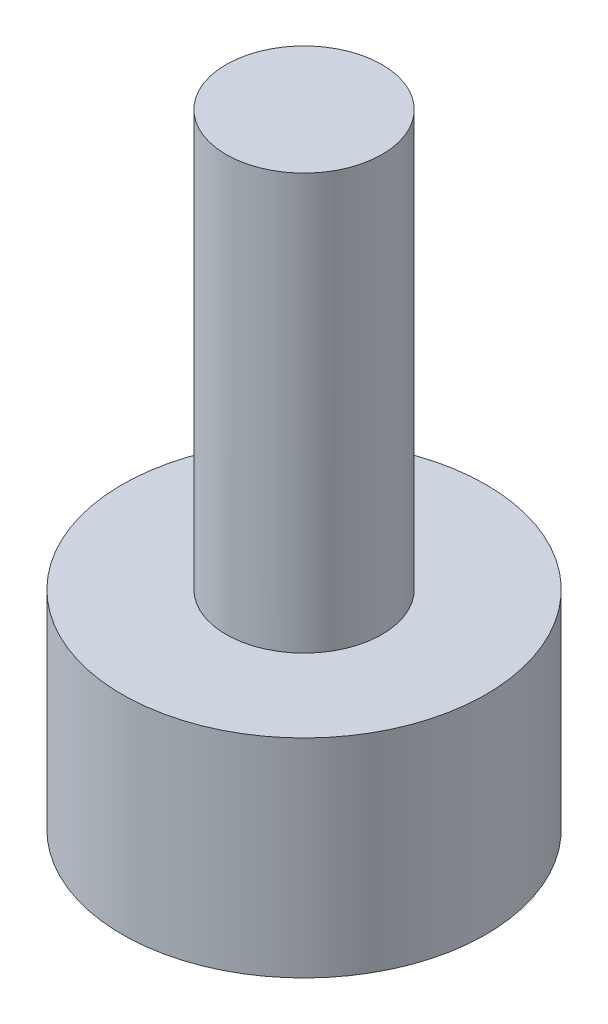
ISO-10303-21;
HEADER;
FILE_DESCRIPTION(('STEP AP214'),'2;1');
FILE_NAME('part.step','',(''),(''),'','','');
FILE_SCHEMA(('AUTOMOTIVE_DESIGN { 1 0 10303 214 1 1 1 1 }'));
ENDSEC;
DATA;
#1=APPLICATION_CONTEXT('core data for automotive mechanical design processes');
#2=APPLICATION_PROTOCOL_DEFINITION('international standard','automotive_design',2000,#1);
#3=PRODUCT_CONTEXT('',#1,'mechanical');
#4=PRODUCT('Part','Part','',(#3));
#5=PRODUCT_RELATED_PRODUCT_CATEGORY('part','',(#4));
#6=PRODUCT_DEFINITION_FORMATION('','',#4);
#7=PRODUCT_DEFINITION_CONTEXT('part definition',#1,'design');
#8=PRODUCT_DEFINITION('design','',#6,#7);
#9=PRODUCT_DEFINITION_SHAPE('','',#8);
#10=(LENGTH_UNIT() NAMED_UNIT(*) SI_UNIT(.MILLI.,.METRE.));
#11=(NAMED_UNIT(*) PLANE_ANGLE_UNIT() SI_UNIT($,.RADIAN.));
#12=(NAMED_UNIT(*) SI_UNIT($,.STERADIAN.) SOLID_ANGLE_UNIT());
#13=UNCERTAINTY_MEASURE_WITH_UNIT(LENGTH_MEASURE(1.E-05),#10,'distance_accuracy_value','');
#14=(GEOMETRIC_REPRESENTATION_CONTEXT(3) GLOBAL_UNCERTAINTY_ASSIGNED_CONTEXT((#13)) GLOBAL_UNIT_ASSIGNED_CONTEXT((#10,
#11,#12)) REPRESENTATION_CONTEXT('',''));
#15=CARTESIAN_POINT('',(0.,0.,0.));
#16=DIRECTION('',(0.,0.,1.));
#17=DIRECTION('',(1.,0.,0.));
#18=AXIS2_PLACEMENT_3D('',#15,#16,#17);
#19=CARTESIAN_POINT('',(0.,32.,0.));
#20=DIRECTION('',(0.,-1.,0.));
#21=DIRECTION('',(0.,0.,-1.));
#22=AXIS2_PLACEMENT_3D('',#19,#20,#21);
#23=CYLINDRICAL_SURFACE('',#22,6.);
#24=CARTESIAN_POINT('',(0.,32.,0.));
#25=DIRECTION('',(0.,1.,0.));
#26=DIRECTION('',(0.,0.,1.));
#27=AXIS2_PLACEMENT_3D('',#24,#25,#26);
#28=CIRCLE('',#27,6.);
#29=CARTESIAN_POINT('',(0.,32.,6.));
#30=VERTEX_POINT('',#29);
#31=EDGE_CURVE('E10',#30,#30,#28,.T.);
#32=ORIENTED_EDGE('',*,*,#31,.F.);
#33=EDGE_LOOP('',(#32));
#34=FACE_BOUND('',#33,.T.);
#35=CARTESIAN_POINT('',(0.,0.,0.));
#36=DIRECTION('',(0.,-1.,0.));
#37=DIRECTION('',(0.,0.,-1.));
#38=AXIS2_PLACEMENT_3D('',#35,#36,#37);
#39=CIRCLE('',#38,6.);
#40=CARTESIAN_POINT('',(0.,0.,-6.));
#41=VERTEX_POINT('',#40);
#42=EDGE_CURVE('E47',#41,#41,#39,.T.);
#43=ORIENTED_EDGE('',*,*,#42,.F.);
#44=EDGE_LOOP('',(#43));
#45=FACE_BOUND('',#44,.T.);
#46=ADVANCED_FACE('F40',(#34,#45),#23,.T.);
#47=CARTESIAN_POINT('',(0.,32.,0.));
#48=DIRECTION('',(0.,1.,0.));
#49=DIRECTION('',(0.,0.,1.));
#50=AXIS2_PLACEMENT_3D('',#47,#48,#49);
#51=PLANE('',#50);
#52=ORIENTED_EDGE('',*,*,#31,.T.);
#53=EDGE_LOOP('',(#52));
#54=FACE_BOUND('',#53,.T.);
#55=ADVANCED_FACE('F78',(#54),#51,.T.);
#56=CARTESIAN_POINT('',(0.,-16.,0.));
#57=DIRECTION('',(0.,-1.,0.));
#58=DIRECTION('',(0.,0.,-1.));
#59=AXIS2_PLACEMENT_3D('',#56,#57,#58);
#60=PLANE('',#59);
#61=CARTESIAN_POINT('',(0.,-16.,0.));
#62=DIRECTION('',(0.,-1.,0.));
#63=DIRECTION('',(0.,0.,-1.));
#64=AXIS2_PLACEMENT_3D('',#61,#62,#63);
#65=CIRCLE('',#64,14.);
#66=CARTESIAN_POINT('',(0.,-16.,-14.));
#67=VERTEX_POINT('',#66);
#68=EDGE_CURVE('E52',#67,#67,#65,.T.);
#69=ORIENTED_EDGE('',*,*,#68,.T.);
#70=EDGE_LOOP('',(#69));
#71=FACE_BOUND('',#70,.T.);
#72=CARTESIAN_POINT('',(0.,-16.,0.));
#73=DIRECTION('',(0.,-1.,0.));
#74=DIRECTION('',(0.,0.,-1.));
#75=AXIS2_PLACEMENT_3D('',#72,#73,#74);
#76=CIRCLE('',#75,2.5);
#77=CARTESIAN_POINT('',(0.,-16.,-2.5));
#78=VERTEX_POINT('',#77);
#79=EDGE_CURVE('E62',#78,#78,#76,.T.);
#80=ORIENTED_EDGE('',*,*,#79,.F.);
#81=EDGE_LOOP('',(#80));
#82=FACE_BOUND('',#81,.T.);
#83=ADVANCED_FACE('F75',(#71,#82),#60,.T.);
#84=CARTESIAN_POINT('',(0.,0.,0.));
#85=DIRECTION('',(0.,-1.,0.));
#86=DIRECTION('',(0.,0.,-1.));
#87=AXIS2_PLACEMENT_3D('',#84,#85,#86);
#88=PLANE('',#87);
#89=ORIENTED_EDGE('',*,*,#42,.T.);
#90=EDGE_LOOP('',(#89));
#91=FACE_BOUND('',#90,.T.);
#92=CARTESIAN_POINT('',(0.,0.,0.));
#93=DIRECTION('',(0.,-1.,0.));
#94=DIRECTION('',(0.,0.,-1.));
#95=AXIS2_PLACEMENT_3D('',#92,#93,#94);
#96=CIRCLE('',#95,14.);
#97=CARTESIAN_POINT('',(0.,0.,-14.));
#98=VERTEX_POINT('',#97);
#99=EDGE_CURVE('E57',#98,#98,#96,.T.);
#100=ORIENTED_EDGE('',*,*,#99,.F.);
#101=EDGE_LOOP('',(#100));
#102=FACE_BOUND('',#101,.T.);
#103=ADVANCED_FACE('F77',(#91,#102),#88,.F.);
#104=CARTESIAN_POINT('',(0.,-16.,0.));
#105=DIRECTION('',(0.,1.,0.));
#106=DIRECTION('',(0.,0.,1.));
#107=AXIS2_PLACEMENT_3D('',#104,#105,#106);
#108=CYLINDRICAL_SURFACE('',#107,14.);
#109=ORIENTED_EDGE('',*,*,#68,.F.);
#110=EDGE_LOOP('',(#109));
#111=FACE_BOUND('',#110,.T.);
#112=ORIENTED_EDGE('',*,*,#99,.T.);
#113=EDGE_LOOP('',(#112));
#114=FACE_BOUND('',#113,.T.);
#115=ADVANCED_FACE('F85',(#111,#114),#108,.T.);
#116=CARTESIAN_POINT('',(0.,-16.,0.));
#117=DIRECTION('',(0.,1.,0.));
#118=DIRECTION('',(0.,0.,1.));
#119=AXIS2_PLACEMENT_3D('',#116,#117,#118);
#120=CYLINDRICAL_SURFACE('',#119,2.5);
#121=ORIENTED_EDGE('',*,*,#79,.T.);
#122=EDGE_LOOP('',(#121));
#123=FACE_BOUND('',#122,.T.);
#124=CARTESIAN_POINT('',(0.,0.,0.));
#125=DIRECTION('',(0.,-1.,0.));
#126=DIRECTION('',(0.,0.,-1.));
#127=AXIS2_PLACEMENT_3D('',#124,#125,#126);
#128=CIRCLE('',#127,2.5);
#129=CARTESIAN_POINT('',(0.,0.,-2.5));
#130=VERTEX_POINT('',#129);
#131=EDGE_CURVE('E64',#130,#130,#128,.T.);
#132=ORIENTED_EDGE('',*,*,#131,.F.);
#133=EDGE_LOOP('',(#132));
#134=FACE_BOUND('',#133,.T.);
#135=ADVANCED_FACE('F72',(#123,#134),#120,.F.);
#136=CARTESIAN_POINT('',(0.,0.,0.));
#137=DIRECTION('',(0.,1.,0.));
#138=DIRECTION('',(0.,0.,1.));
#139=AXIS2_PLACEMENT_3D('',#136,#137,#138);
#140=PLANE('',#139);
#141=ORIENTED_EDGE('',*,*,#131,.T.);
#142=EDGE_LOOP('',(#141));
#143=FACE_BOUND('',#142,.T.);
#144=ADVANCED_FACE('F131',(#143),#140,.F.);
#145=CLOSED_SHELL('',(#46,#55,#83,#103,#115,#135,#144));
#146=MANIFOLD_SOLID_BREP('B2',#145);
#147=ADVANCED_BREP_SHAPE_REPRESENTATION('',(#18,#146),#14);
#148=SHAPE_DEFINITION_REPRESENTATION(#9,#147);
ENDSEC;
END-ISO-10303-21;
